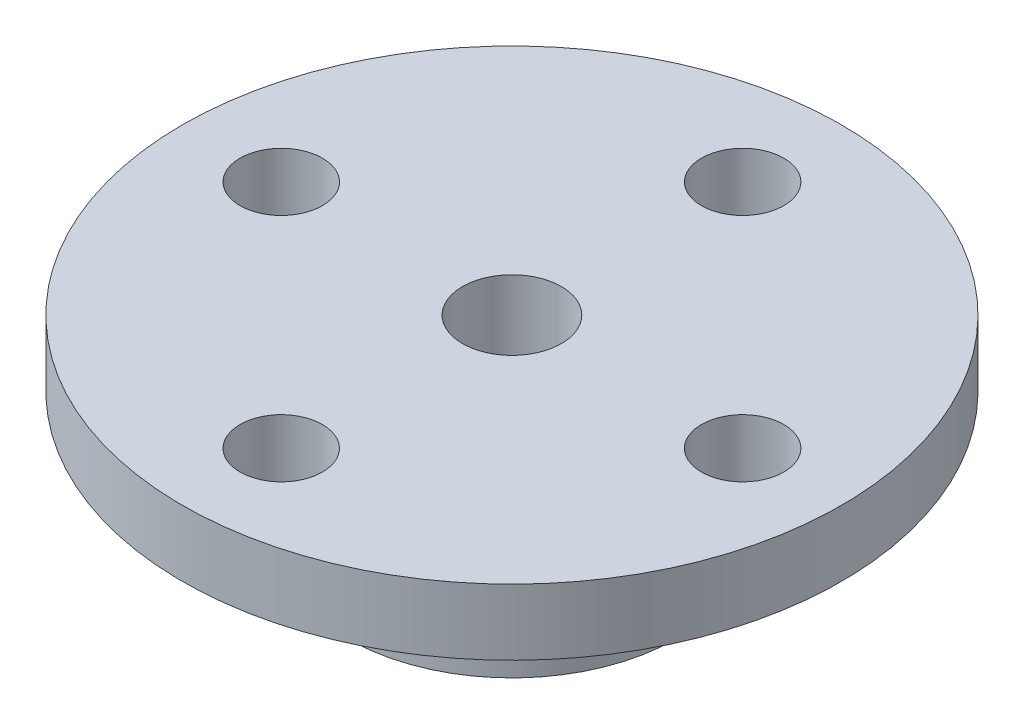
ISO-10303-21;
HEADER;
FILE_DESCRIPTION(('STEP AP214'),'2;1');
FILE_NAME('part.step','',(''),(''),'','','');
FILE_SCHEMA(('AUTOMOTIVE_DESIGN { 1 0 10303 214 1 1 1 1 }'));
ENDSEC;
DATA;
#1=APPLICATION_CONTEXT('core data for automotive mechanical design processes');
#2=APPLICATION_PROTOCOL_DEFINITION('international standard','automotive_design',2000,#1);
#3=PRODUCT_CONTEXT('',#1,'mechanical');
#4=PRODUCT('Part','Part','',(#3));
#5=PRODUCT_RELATED_PRODUCT_CATEGORY('part','',(#4));
#6=PRODUCT_DEFINITION_FORMATION('','',#4);
#7=PRODUCT_DEFINITION_CONTEXT('part definition',#1,'design');
#8=PRODUCT_DEFINITION('design','',#6,#7);
#9=PRODUCT_DEFINITION_SHAPE('','',#8);
#10=(LENGTH_UNIT() NAMED_UNIT(*) SI_UNIT(.MILLI.,.METRE.));
#11=(NAMED_UNIT(*) PLANE_ANGLE_UNIT() SI_UNIT($,.RADIAN.));
#12=(NAMED_UNIT(*) SI_UNIT($,.STERADIAN.) SOLID_ANGLE_UNIT());
#13=UNCERTAINTY_MEASURE_WITH_UNIT(LENGTH_MEASURE(1.E-05),#10,'distance_accuracy_value','');
#14=(GEOMETRIC_REPRESENTATION_CONTEXT(3) GLOBAL_UNCERTAINTY_ASSIGNED_CONTEXT((#13)) GLOBAL_UNIT_ASSIGNED_CONTEXT((#10,
#11,#12)) REPRESENTATION_CONTEXT('',''));
#15=CARTESIAN_POINT('',(0.,0.,0.));
#16=DIRECTION('',(0.,0.,1.));
#17=DIRECTION('',(1.,0.,0.));
#18=AXIS2_PLACEMENT_3D('',#15,#16,#17);
#19=CARTESIAN_POINT('',(0.,0.,0.));
#20=DIRECTION('',(0.,1.,0.));
#21=DIRECTION('',(-1.,0.,0.));
#22=AXIS2_PLACEMENT_3D('',#19,#20,#21);
#23=CYLINDRICAL_SURFACE('',#22,10.);
#24=CARTESIAN_POINT('',(0.,0.,0.));
#25=DIRECTION('',(0.,1.,0.));
#26=DIRECTION('',(-1.,0.,0.));
#27=AXIS2_PLACEMENT_3D('',#24,#25,#26);
#28=CIRCLE('',#27,10.);
#29=CARTESIAN_POINT('',(-10.,0.,0.));
#30=VERTEX_POINT('',#29);
#31=EDGE_CURVE('E62',#30,#30,#28,.T.);
#32=ORIENTED_EDGE('',*,*,#31,.F.);
#33=EDGE_LOOP('',(#32));
#34=FACE_BOUND('',#33,.T.);
#35=CARTESIAN_POINT('',(0.,-2.,0.));
#36=DIRECTION('',(0.,1.,0.));
#37=DIRECTION('',(-1.,0.,0.));
#38=AXIS2_PLACEMENT_3D('',#35,#36,#37);
#39=CIRCLE('',#38,10.);
#40=CARTESIAN_POINT('',(-10.,-2.,0.));
#41=VERTEX_POINT('',#40);
#42=EDGE_CURVE('E10',#41,#41,#39,.T.);
#43=ORIENTED_EDGE('',*,*,#42,.T.);
#44=EDGE_LOOP('',(#43));
#45=FACE_BOUND('',#44,.T.);
#46=ADVANCED_FACE('F34',(#34,#45),#23,.T.);
#47=CARTESIAN_POINT('',(10.,-2.,0.));
#48=DIRECTION('',(0.,1.,0.));
#49=DIRECTION('',(-1.,0.,0.));
#50=AXIS2_PLACEMENT_3D('',#47,#48,#49);
#51=PLANE('',#50);
#52=CARTESIAN_POINT('',(-7.,-2.,0.));
#53=DIRECTION('',(0.,-1.,0.));
#54=DIRECTION('',(0.,0.,-1.));
#55=AXIS2_PLACEMENT_3D('',#52,#53,#54);
#56=CIRCLE('',#55,1.24999999999999);
#57=CARTESIAN_POINT('',(-7.,-2.,-1.24999999999999));
#58=VERTEX_POINT('',#57);
#59=EDGE_CURVE('E86',#58,#58,#56,.T.);
#60=ORIENTED_EDGE('',*,*,#59,.F.);
#61=EDGE_LOOP('',(#60));
#62=FACE_BOUND('',#61,.T.);
#63=CARTESIAN_POINT('',(0.,-2.,7.));
#64=DIRECTION('',(0.,-1.,0.));
#65=DIRECTION('',(0.,0.,-1.));
#66=AXIS2_PLACEMENT_3D('',#63,#64,#65);
#67=CIRCLE('',#66,1.24999999999999);
#68=CARTESIAN_POINT('',(0.,-2.,5.75000000000001));
#69=VERTEX_POINT('',#68);
#70=EDGE_CURVE('E80',#69,#69,#67,.T.);
#71=ORIENTED_EDGE('',*,*,#70,.F.);
#72=EDGE_LOOP('',(#71));
#73=FACE_BOUND('',#72,.T.);
#74=CARTESIAN_POINT('',(7.,-2.,0.));
#75=DIRECTION('',(0.,-1.,0.));
#76=DIRECTION('',(0.,0.,-1.));
#77=AXIS2_PLACEMENT_3D('',#74,#75,#76);
#78=CIRCLE('',#77,1.24999999999999);
#79=CARTESIAN_POINT('',(7.,-2.,-1.24999999999999));
#80=VERTEX_POINT('',#79);
#81=EDGE_CURVE('E74',#80,#80,#78,.T.);
#82=ORIENTED_EDGE('',*,*,#81,.F.);
#83=EDGE_LOOP('',(#82));
#84=FACE_BOUND('',#83,.T.);
#85=CARTESIAN_POINT('',(0.,-2.,-7.));
#86=DIRECTION('',(0.,-1.,0.));
#87=DIRECTION('',(0.,0.,-1.));
#88=AXIS2_PLACEMENT_3D('',#85,#86,#87);
#89=CIRCLE('',#88,1.24999999999999);
#90=CARTESIAN_POINT('',(0.,-2.,-8.24999999999999));
#91=VERTEX_POINT('',#90);
#92=EDGE_CURVE('E68',#91,#91,#89,.T.);
#93=ORIENTED_EDGE('',*,*,#92,.F.);
#94=EDGE_LOOP('',(#93));
#95=FACE_BOUND('',#94,.T.);
#96=ORIENTED_EDGE('',*,*,#42,.F.);
#97=EDGE_LOOP('',(#96));
#98=FACE_BOUND('',#97,.T.);
#99=CARTESIAN_POINT('',(0.,-2.,0.));
#100=DIRECTION('',(0.,1.,0.));
#101=DIRECTION('',(-1.,0.,0.));
#102=AXIS2_PLACEMENT_3D('',#99,#100,#101);
#103=CIRCLE('',#102,5.);
#104=CARTESIAN_POINT('',(-5.,-2.,0.));
#105=VERTEX_POINT('',#104);
#106=EDGE_CURVE('E40',#105,#105,#103,.T.);
#107=ORIENTED_EDGE('',*,*,#106,.T.);
#108=EDGE_LOOP('',(#107));
#109=FACE_BOUND('',#108,.T.);
#110=ADVANCED_FACE('F92',(#62,#73,#84,#95,#98,#109),#51,.F.);
#111=CARTESIAN_POINT('',(0.,0.,0.));
#112=DIRECTION('',(0.,1.,0.));
#113=DIRECTION('',(-1.,0.,0.));
#114=AXIS2_PLACEMENT_3D('',#111,#112,#113);
#115=CYLINDRICAL_SURFACE('',#114,5.);
#116=ORIENTED_EDGE('',*,*,#106,.F.);
#117=EDGE_LOOP('',(#116));
#118=FACE_BOUND('',#117,.T.);
#119=CARTESIAN_POINT('',(0.,-6.,0.));
#120=DIRECTION('',(0.,1.,0.));
#121=DIRECTION('',(-1.,0.,0.));
#122=AXIS2_PLACEMENT_3D('',#119,#120,#121);
#123=CIRCLE('',#122,5.);
#124=CARTESIAN_POINT('',(-5.,-6.,0.));
#125=VERTEX_POINT('',#124);
#126=EDGE_CURVE('E44',#125,#125,#123,.T.);
#127=ORIENTED_EDGE('',*,*,#126,.T.);
#128=EDGE_LOOP('',(#127));
#129=FACE_BOUND('',#128,.T.);
#130=ADVANCED_FACE('F95',(#118,#129),#115,.T.);
#131=CARTESIAN_POINT('',(5.,-6.,0.));
#132=DIRECTION('',(0.,1.,0.));
#133=DIRECTION('',(-1.,0.,0.));
#134=AXIS2_PLACEMENT_3D('',#131,#132,#133);
#135=PLANE('',#134);
#136=ORIENTED_EDGE('',*,*,#126,.F.);
#137=EDGE_LOOP('',(#136));
#138=FACE_BOUND('',#137,.T.);
#139=CARTESIAN_POINT('',(0.,-6.,0.));
#140=DIRECTION('',(0.,1.,0.));
#141=DIRECTION('',(-1.,0.,0.));
#142=AXIS2_PLACEMENT_3D('',#139,#140,#141);
#143=CIRCLE('',#142,3.);
#144=CARTESIAN_POINT('',(-3.,-6.,0.));
#145=VERTEX_POINT('',#144);
#146=EDGE_CURVE('E48',#145,#145,#143,.T.);
#147=ORIENTED_EDGE('',*,*,#146,.T.);
#148=EDGE_LOOP('',(#147));
#149=FACE_BOUND('',#148,.T.);
#150=ADVANCED_FACE('F138',(#138,#149),#135,.F.);
#151=CARTESIAN_POINT('',(0.,0.,0.));
#152=DIRECTION('',(0.,1.,0.));
#153=DIRECTION('',(-1.,0.,0.));
#154=AXIS2_PLACEMENT_3D('',#151,#152,#153);
#155=CYLINDRICAL_SURFACE('',#154,3.);
#156=ORIENTED_EDGE('',*,*,#146,.F.);
#157=EDGE_LOOP('',(#156));
#158=FACE_BOUND('',#157,.T.);
#159=CARTESIAN_POINT('',(0.,-3.,0.));
#160=DIRECTION('',(0.,1.,0.));
#161=DIRECTION('',(-1.,0.,0.));
#162=AXIS2_PLACEMENT_3D('',#159,#160,#161);
#163=CIRCLE('',#162,3.);
#164=CARTESIAN_POINT('',(-3.,-3.,0.));
#165=VERTEX_POINT('',#164);
#166=EDGE_CURVE('E53',#165,#165,#163,.T.);
#167=ORIENTED_EDGE('',*,*,#166,.T.);
#168=EDGE_LOOP('',(#167));
#169=FACE_BOUND('',#168,.T.);
#170=ADVANCED_FACE('F146',(#158,#169),#155,.F.);
#171=CARTESIAN_POINT('',(1.5,-3.,0.));
#172=DIRECTION('',(0.,1.,0.));
#173=DIRECTION('',(-1.,0.,0.));
#174=AXIS2_PLACEMENT_3D('',#171,#172,#173);
#175=PLANE('',#174);
#176=ORIENTED_EDGE('',*,*,#166,.F.);
#177=EDGE_LOOP('',(#176));
#178=FACE_BOUND('',#177,.T.);
#179=CARTESIAN_POINT('',(0.,-3.,0.));
#180=DIRECTION('',(0.,1.,0.));
#181=DIRECTION('',(-1.,0.,0.));
#182=AXIS2_PLACEMENT_3D('',#179,#180,#181);
#183=CIRCLE('',#182,1.5);
#184=CARTESIAN_POINT('',(-1.5,-3.,0.));
#185=VERTEX_POINT('',#184);
#186=EDGE_CURVE('E56',#185,#185,#183,.T.);
#187=ORIENTED_EDGE('',*,*,#186,.T.);
#188=EDGE_LOOP('',(#187));
#189=FACE_BOUND('',#188,.T.);
#190=ADVANCED_FACE('F154',(#178,#189),#175,.F.);
#191=CARTESIAN_POINT('',(0.,0.,0.));
#192=DIRECTION('',(0.,1.,0.));
#193=DIRECTION('',(-1.,0.,0.));
#194=AXIS2_PLACEMENT_3D('',#191,#192,#193);
#195=CYLINDRICAL_SURFACE('',#194,1.5);
#196=ORIENTED_EDGE('',*,*,#186,.F.);
#197=EDGE_LOOP('',(#196));
#198=FACE_BOUND('',#197,.T.);
#199=CARTESIAN_POINT('',(0.,0.,0.));
#200=DIRECTION('',(0.,1.,0.));
#201=DIRECTION('',(-1.,0.,0.));
#202=AXIS2_PLACEMENT_3D('',#199,#200,#201);
#203=CIRCLE('',#202,1.5);
#204=CARTESIAN_POINT('',(-1.5,0.,0.));
#205=VERTEX_POINT('',#204);
#206=EDGE_CURVE('E59',#205,#205,#203,.T.);
#207=ORIENTED_EDGE('',*,*,#206,.T.);
#208=EDGE_LOOP('',(#207));
#209=FACE_BOUND('',#208,.T.);
#210=ADVANCED_FACE('F116',(#198,#209),#195,.F.);
#211=CARTESIAN_POINT('',(10.,0.,0.));
#212=DIRECTION('',(0.,-1.,0.));
#213=DIRECTION('',(1.,0.,0.));
#214=AXIS2_PLACEMENT_3D('',#211,#212,#213);
#215=PLANE('',#214);
#216=CARTESIAN_POINT('',(-7.,0.,0.));
#217=DIRECTION('',(0.,-1.,0.));
#218=DIRECTION('',(0.,0.,-1.));
#219=AXIS2_PLACEMENT_3D('',#216,#217,#218);
#220=CIRCLE('',#219,1.25);
#221=CARTESIAN_POINT('',(-7.,0.,-1.25));
#222=VERTEX_POINT('',#221);
#223=EDGE_CURVE('E83',#222,#222,#220,.T.);
#224=ORIENTED_EDGE('',*,*,#223,.T.);
#225=EDGE_LOOP('',(#224));
#226=FACE_BOUND('',#225,.T.);
#227=CARTESIAN_POINT('',(0.,0.,7.));
#228=DIRECTION('',(0.,-1.,0.));
#229=DIRECTION('',(0.,0.,-1.));
#230=AXIS2_PLACEMENT_3D('',#227,#228,#229);
#231=CIRCLE('',#230,1.25);
#232=CARTESIAN_POINT('',(0.,0.,5.75));
#233=VERTEX_POINT('',#232);
#234=EDGE_CURVE('E77',#233,#233,#231,.T.);
#235=ORIENTED_EDGE('',*,*,#234,.T.);
#236=EDGE_LOOP('',(#235));
#237=FACE_BOUND('',#236,.T.);
#238=CARTESIAN_POINT('',(7.,0.,0.));
#239=DIRECTION('',(0.,-1.,0.));
#240=DIRECTION('',(0.,0.,-1.));
#241=AXIS2_PLACEMENT_3D('',#238,#239,#240);
#242=CIRCLE('',#241,1.25);
#243=CARTESIAN_POINT('',(7.,0.,-1.25));
#244=VERTEX_POINT('',#243);
#245=EDGE_CURVE('E71',#244,#244,#242,.T.);
#246=ORIENTED_EDGE('',*,*,#245,.T.);
#247=EDGE_LOOP('',(#246));
#248=FACE_BOUND('',#247,.T.);
#249=CARTESIAN_POINT('',(0.,0.,-7.));
#250=DIRECTION('',(0.,-1.,0.));
#251=DIRECTION('',(0.,0.,-1.));
#252=AXIS2_PLACEMENT_3D('',#249,#250,#251);
#253=CIRCLE('',#252,1.25);
#254=CARTESIAN_POINT('',(0.,0.,-8.25));
#255=VERTEX_POINT('',#254);
#256=EDGE_CURVE('E65',#255,#255,#253,.T.);
#257=ORIENTED_EDGE('',*,*,#256,.T.);
#258=EDGE_LOOP('',(#257));
#259=FACE_BOUND('',#258,.T.);
#260=ORIENTED_EDGE('',*,*,#206,.F.);
#261=EDGE_LOOP('',(#260));
#262=FACE_BOUND('',#261,.T.);
#263=ORIENTED_EDGE('',*,*,#31,.T.);
#264=EDGE_LOOP('',(#263));
#265=FACE_BOUND('',#264,.T.);
#266=ADVANCED_FACE('F106',(#226,#237,#248,#259,#262,#265),#215,.F.);
#267=CARTESIAN_POINT('',(0.,-2.,-7.));
#268=DIRECTION('',(0.,-1.,0.));
#269=DIRECTION('',(0.,0.,-1.));
#270=AXIS2_PLACEMENT_3D('',#267,#268,#269);
#271=CYLINDRICAL_SURFACE('',#270,1.24999999999999);
#272=ORIENTED_EDGE('',*,*,#256,.F.);
#273=EDGE_LOOP('',(#272));
#274=FACE_BOUND('',#273,.T.);
#275=ORIENTED_EDGE('',*,*,#92,.T.);
#276=EDGE_LOOP('',(#275));
#277=FACE_BOUND('',#276,.T.);
#278=ADVANCED_FACE('F103',(#274,#277),#271,.F.);
#279=CARTESIAN_POINT('',(7.,-2.,0.));
#280=DIRECTION('',(0.,-1.,0.));
#281=DIRECTION('',(0.,0.,-1.));
#282=AXIS2_PLACEMENT_3D('',#279,#280,#281);
#283=CYLINDRICAL_SURFACE('',#282,1.24999999999999);
#284=ORIENTED_EDGE('',*,*,#245,.F.);
#285=EDGE_LOOP('',(#284));
#286=FACE_BOUND('',#285,.T.);
#287=ORIENTED_EDGE('',*,*,#81,.T.);
#288=EDGE_LOOP('',(#287));
#289=FACE_BOUND('',#288,.T.);
#290=ADVANCED_FACE('F105',(#286,#289),#283,.F.);
#291=CARTESIAN_POINT('',(0.,-2.,7.));
#292=DIRECTION('',(0.,-1.,0.));
#293=DIRECTION('',(0.,0.,-1.));
#294=AXIS2_PLACEMENT_3D('',#291,#292,#293);
#295=CYLINDRICAL_SURFACE('',#294,1.24999999999999);
#296=ORIENTED_EDGE('',*,*,#234,.F.);
#297=EDGE_LOOP('',(#296));
#298=FACE_BOUND('',#297,.T.);
#299=ORIENTED_EDGE('',*,*,#70,.T.);
#300=EDGE_LOOP('',(#299));
#301=FACE_BOUND('',#300,.T.);
#302=ADVANCED_FACE('F113',(#298,#301),#295,.F.);
#303=CARTESIAN_POINT('',(-7.,-2.,0.));
#304=DIRECTION('',(0.,-1.,0.));
#305=DIRECTION('',(0.,0.,-1.));
#306=AXIS2_PLACEMENT_3D('',#303,#304,#305);
#307=CYLINDRICAL_SURFACE('',#306,1.24999999999999);
#308=ORIENTED_EDGE('',*,*,#223,.F.);
#309=EDGE_LOOP('',(#308));
#310=FACE_BOUND('',#309,.T.);
#311=ORIENTED_EDGE('',*,*,#59,.T.);
#312=EDGE_LOOP('',(#311));
#313=FACE_BOUND('',#312,.T.);
#314=ADVANCED_FACE('F90',(#310,#313),#307,.F.);
#315=CLOSED_SHELL('',(#46,#110,#130,#150,#170,#190,#210,#266,#278,#290,#302,#314));
#316=MANIFOLD_SOLID_BREP('B2',#315);
#317=ADVANCED_BREP_SHAPE_REPRESENTATION('',(#18,#316),#14);
#318=SHAPE_DEFINITION_REPRESENTATION(#9,#317);
ENDSEC;
END-ISO-10303-21;
